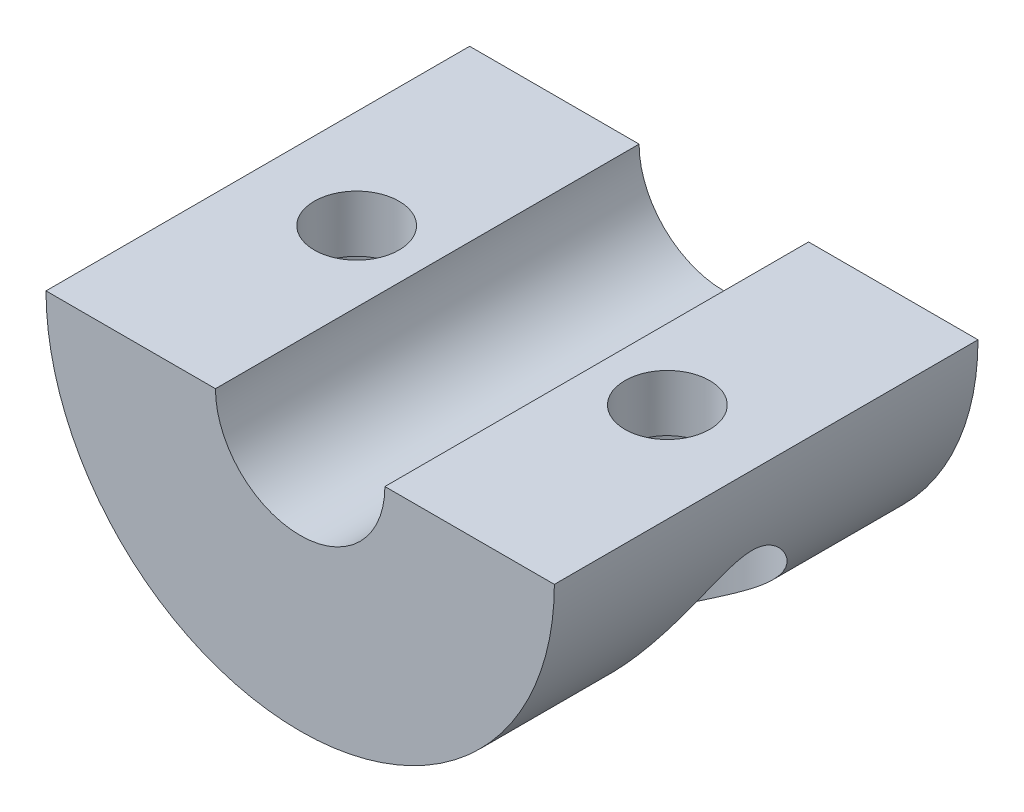
ISO-10303-21;
HEADER;
FILE_DESCRIPTION(('STEP AP214'),'2;1');
FILE_NAME('part.step','',(''),(''),'','','');
FILE_SCHEMA(('AUTOMOTIVE_DESIGN { 1 0 10303 214 1 1 1 1 }'));
ENDSEC;
DATA;
#1=APPLICATION_CONTEXT('core data for automotive mechanical design processes');
#2=APPLICATION_PROTOCOL_DEFINITION('international standard','automotive_design',2000,#1);
#3=PRODUCT_CONTEXT('',#1,'mechanical');
#4=PRODUCT('Part','Part','',(#3));
#5=PRODUCT_RELATED_PRODUCT_CATEGORY('part','',(#4));
#6=PRODUCT_DEFINITION_FORMATION('','',#4);
#7=PRODUCT_DEFINITION_CONTEXT('part definition',#1,'design');
#8=PRODUCT_DEFINITION('design','',#6,#7);
#9=PRODUCT_DEFINITION_SHAPE('','',#8);
#10=(LENGTH_UNIT() NAMED_UNIT(*) SI_UNIT(.MILLI.,.METRE.));
#11=(NAMED_UNIT(*) PLANE_ANGLE_UNIT() SI_UNIT($,.RADIAN.));
#12=(NAMED_UNIT(*) SI_UNIT($,.STERADIAN.) SOLID_ANGLE_UNIT());
#13=UNCERTAINTY_MEASURE_WITH_UNIT(LENGTH_MEASURE(1.E-05),#10,'distance_accuracy_value','');
#14=(GEOMETRIC_REPRESENTATION_CONTEXT(3) GLOBAL_UNCERTAINTY_ASSIGNED_CONTEXT((#13)) GLOBAL_UNIT_ASSIGNED_CONTEXT((#10,
#11,#12)) REPRESENTATION_CONTEXT('',''));
#15=CARTESIAN_POINT('',(0.,0.,0.));
#16=DIRECTION('',(0.,0.,1.));
#17=DIRECTION('',(1.,0.,0.));
#18=AXIS2_PLACEMENT_3D('',#15,#16,#17);
#19=CARTESIAN_POINT('',(0.,0.,15.));
#20=DIRECTION('',(0.,0.,-1.));
#21=DIRECTION('',(-1.,0.,0.));
#22=AXIS2_PLACEMENT_3D('',#19,#20,#21);
#23=CYLINDRICAL_SURFACE('',#22,9.);
#24=CARTESIAN_POINT('',(5.5,-7.1239034243875,10.5));
#25=CARTESIAN_POINT('',(5.60043019334585,-7.04636290751093,10.4999986467329));
#26=CARTESIAN_POINT('',(5.69925774388211,-6.9666650467977,10.4949544002959));
#27=CARTESIAN_POINT('',(5.89295478669658,-6.80361486085154,10.4757477643885));
#28=CARTESIAN_POINT('',(5.98782124651145,-6.72025983243076,10.4615785206694));
#29=CARTESIAN_POINT('',(6.26637499477537,-6.46497698418274,10.4066433790906));
#30=CARTESIAN_POINT('',(6.44342056919998,-6.28829329603147,10.3534607922039));
#31=CARTESIAN_POINT('',(6.72669497110865,-5.98173078980887,10.2406038234333));
#32=CARTESIAN_POINT('',(6.8381108383174,-5.85391775878404,10.1877961165076));
#33=CARTESIAN_POINT('',(7.05124941686432,-5.59534735528108,10.0706824952772));
#34=CARTESIAN_POINT('',(7.15296710511801,-5.46458849991925,10.0063706715827));
#35=CARTESIAN_POINT('',(7.34658575479974,-5.20138388262752,9.86734759907076));
#36=CARTESIAN_POINT('',(7.43848615674092,-5.06893802503633,9.79263575811495));
#37=CARTESIAN_POINT('',(7.61250723220998,-4.8036299305669,9.63336159329271));
#38=CARTESIAN_POINT('',(7.69463234955453,-4.6707679112846,9.5488037802291));
#39=CARTESIAN_POINT('',(7.81765615984879,-4.46010168389394,9.40614099716847));
#40=CARTESIAN_POINT('',(7.86172089471834,-4.38191640123308,9.35129179519915));
#41=CARTESIAN_POINT('',(7.94640337586003,-4.22640556362927,9.23785030300556));
#42=CARTESIAN_POINT('',(7.98702164504367,-4.14907987981719,9.17925858298405));
#43=CARTESIAN_POINT('',(8.06467882562589,-3.99603595922548,9.05807401696405));
#44=CARTESIAN_POINT('',(8.10172421151354,-3.92031501651726,8.99548876336166));
#45=CARTESIAN_POINT('',(8.17217152543776,-3.77125943543762,8.86563405018168));
#46=CARTESIAN_POINT('',(8.2055749731205,-3.69792381079343,8.79836656367216));
#47=CARTESIAN_POINT('',(8.2694908076608,-3.5527460407403,8.6559482853786));
#48=CARTESIAN_POINT('',(8.29987701564049,-3.48102611812021,8.58061449515018));
#49=CARTESIAN_POINT('',(8.35593750619934,-3.34420960098481,8.42232386942591));
#50=CARTESIAN_POINT('',(8.38161226945432,-3.27911233110877,8.33936781287408));
#51=CARTESIAN_POINT('',(8.42079893640972,-3.17683580623818,8.18793329146569));
#52=CARTESIAN_POINT('',(8.43571567996303,-3.13689517287922,8.12171962866343));
#53=CARTESIAN_POINT('',(8.46157495554027,-3.06645627486888,7.98370485799562));
#54=CARTESIAN_POINT('',(8.47252760762405,-3.03593399561619,7.91191855458994));
#55=CARTESIAN_POINT('',(8.48720168162957,-2.99462297630504,7.78234102144865));
#56=CARTESIAN_POINT('',(8.49205656710563,-2.98078260240889,7.72567250448905));
#57=CARTESIAN_POINT('',(8.49850807585127,-2.96234057463549,7.61068339657109));
#58=CARTESIAN_POINT('',(8.50010915093059,-2.95772629790397,7.55236517370155));
#59=CARTESIAN_POINT('',(8.49987896510568,-2.95838763385528,7.43569253207026));
#60=CARTESIAN_POINT('',(8.49804175039547,-2.96368040176206,7.37733822576415));
#61=CARTESIAN_POINT('',(8.49113203826252,-2.98341754285782,7.26238776180772));
#62=CARTESIAN_POINT('',(8.4860551654364,-2.9978742925221,7.20579409060414));
#63=CARTESIAN_POINT('',(8.47034221935345,-3.04204687664961,7.07177875243727));
#64=CARTESIAN_POINT('',(8.45825573104125,-3.0756479172715,6.99583445616859));
#65=CARTESIAN_POINT('',(8.42972690750022,-3.15299899707453,6.85018950683518));
#66=CARTESIAN_POINT('',(8.41327067954728,-3.19678134956594,6.78050973347005));
#67=CARTESIAN_POINT('',(8.37687697666611,-3.29097186314484,6.64653441513459));
#68=CARTESIAN_POINT('',(8.35692870286264,-3.34140045401913,6.58225651538883));
#69=CARTESIAN_POINT('',(8.31410896358434,-3.44656707237235,6.45832219541537));
#70=CARTESIAN_POINT('',(8.29123445334299,-3.50130956538103,6.39867069432915));
#71=CARTESIAN_POINT('',(8.24283434879403,-3.6137848737002,6.28312256201752));
#72=CARTESIAN_POINT('',(8.21730240511155,-3.67152467762006,6.22723547477037));
#73=CARTESIAN_POINT('',(8.16381033052517,-3.78898103961282,6.11878153210275));
#74=CARTESIAN_POINT('',(8.13584932339549,-3.84869830616021,6.06621588672175));
#75=CARTESIAN_POINT('',(8.04530384584113,-4.03646184175983,5.90724075451792));
#76=CARTESIAN_POINT('',(7.97872335207041,-4.16681014888681,5.8057969912726));
#77=CARTESIAN_POINT('',(7.83568236138279,-4.42996669387672,5.61349113049572));
#78=CARTESIAN_POINT('',(7.75921293771835,-4.56277706030345,5.5226387364448));
#79=CARTESIAN_POINT('',(7.59649726014491,-4.82882367227846,5.35088714226454));
#80=CARTESIAN_POINT('',(7.5102521745918,-4.96205986508748,5.26998675510812));
#81=CARTESIAN_POINT('',(7.32794574765696,-5.22753690947968,5.11826338926049));
#82=CARTESIAN_POINT('',(7.23188589004114,-5.35977790827728,5.04743889119017));
#83=CARTESIAN_POINT('',(7.04551425498024,-5.60181400722508,4.926728206905));
#84=CARTESIAN_POINT('',(6.95660671900843,-5.71192087539517,4.87529762421303));
#85=CARTESIAN_POINT('',(6.77176317299134,-5.92989427986169,4.78092115522304));
#86=CARTESIAN_POINT('',(6.67582652501382,-6.03776061167353,4.73797604034065));
#87=CARTESIAN_POINT('',(6.47724316229137,-6.25031319787287,4.66164084855753));
#88=CARTESIAN_POINT('',(6.37460922339551,-6.35500497956469,4.62823319675822));
#89=CARTESIAN_POINT('',(6.16287764183733,-6.56054468257396,4.5721000772303));
#90=CARTESIAN_POINT('',(6.05378224472745,-6.66139391950082,4.54937092264594));
#91=CARTESIAN_POINT('',(5.77584169683271,-6.90565983475348,4.50801721134293));
#92=CARTESIAN_POINT('',(5.60336985155964,-7.04637268929583,4.49655203742218));
#93=CARTESIAN_POINT('',(5.33772983337906,-7.24713989742888,4.50308297485385));
#94=CARTESIAN_POINT('',(5.24803474925059,-7.31234079906852,4.50921339222149));
#95=CARTESIAN_POINT('',(5.06698862526219,-7.43894025653827,4.53001425687325));
#96=CARTESIAN_POINT('',(4.97563784928503,-7.50033941151723,4.54468335466634));
#97=CARTESIAN_POINT('',(4.73063356608244,-7.65860115201115,4.59612457577166));
#98=CARTESIAN_POINT('',(4.57612376275255,-7.75175629668295,4.6411157755263));
#99=CARTESIAN_POINT('',(4.34674587907463,-7.88121869107903,4.72930472542871));
#100=CARTESIAN_POINT('',(4.27065575214319,-7.92267498642051,4.76216792940731));
#101=CARTESIAN_POINT('',(4.1200173971631,-8.00204178125944,4.83492420540464));
#102=CARTESIAN_POINT('',(4.04546844345582,-8.03995398053567,4.87481388071434));
#103=CARTESIAN_POINT('',(3.89830053253784,-8.11233795619825,4.96190690681698));
#104=CARTESIAN_POINT('',(3.82569591949428,-8.14678761434575,5.00915289807265));
#105=CARTESIAN_POINT('',(3.68380533022886,-8.21192232818842,5.11064029507273));
#106=CARTESIAN_POINT('',(3.61451791728334,-8.24260902283137,5.16487863405359));
#107=CARTESIAN_POINT('',(3.48011868426986,-8.30024839335575,5.28010910184128));
#108=CARTESIAN_POINT('',(3.41500714867262,-8.3272008149944,5.3411016899936));
#109=CARTESIAN_POINT('',(3.28982965206059,-8.37744415209126,5.46943854864975));
#110=CARTESIAN_POINT('',(3.2297632242726,-8.40073540645469,5.53678223032407));
#111=CARTESIAN_POINT('',(3.12109020521157,-8.44167226404446,5.67039364278036));
#112=CARTESIAN_POINT('',(3.07193749985787,-8.45964768884358,5.73611737340666));
#113=CARTESIAN_POINT('',(2.97889077848157,-8.49285882635141,5.87187742751455));
#114=CARTESIAN_POINT('',(2.93499858733262,-8.50809358923675,5.94191523486808));
#115=CARTESIAN_POINT('',(2.85298141367857,-8.53594605946476,6.08573762245318));
#116=CARTESIAN_POINT('',(2.81485319228271,-8.54856523804749,6.15952006712771));
#117=CARTESIAN_POINT('',(2.74471863566083,-8.57134016724721,6.31031367065734));
#118=CARTESIAN_POINT('',(2.71271455188422,-8.58149501225463,6.38732600429695));
#119=CARTESIAN_POINT('',(2.62840481693083,-8.60784148837358,6.6169207069472));
#120=CARTESIAN_POINT('',(2.58487625815975,-8.62087186905231,6.77321453767704));
#121=CARTESIAN_POINT('',(2.52358063814606,-8.63901423057393,7.09112712714489));
#122=CARTESIAN_POINT('',(2.50581265523487,-8.64412649471369,7.25274569516147));
#123=CARTESIAN_POINT('',(2.49661430318035,-8.64678801315301,7.57661524078175));
#124=CARTESIAN_POINT('',(2.50515181729307,-8.64434648996062,7.73886520585135));
#125=CARTESIAN_POINT('',(2.54821028115071,-8.63175062515168,8.05956930477715));
#126=CARTESIAN_POINT('',(2.58273108401086,-8.62159632713582,8.218023460086));
#127=CARTESIAN_POINT('',(2.676542242543,-8.59293370020968,8.52669922860852));
#128=CARTESIAN_POINT('',(2.73584235769209,-8.57442207948772,8.67691757170039));
#129=CARTESIAN_POINT('',(2.87700189655624,-8.52809175434534,8.96477752268824));
#130=CARTESIAN_POINT('',(2.95885948029607,-8.50027380898677,9.10242015514523));
#131=CARTESIAN_POINT('',(3.14186159051849,-8.43434170146736,9.36125794716261));
#132=CARTESIAN_POINT('',(3.24298938794786,-8.39623645814861,9.48246721795082));
#133=CARTESIAN_POINT('',(3.46049990367638,-8.30894930330458,9.70561059076733));
#134=CARTESIAN_POINT('',(3.57688089951245,-8.25976864201799,9.80754686602316));
#135=CARTESIAN_POINT('',(3.8223857497299,-8.14909655962454,9.99190376613806));
#136=CARTESIAN_POINT('',(3.95169412100917,-8.08740822259844,10.0739591708971));
#137=CARTESIAN_POINT('',(4.21646733608392,-7.95257738930879,10.2157185611764));
#138=CARTESIAN_POINT('',(4.3519359665733,-7.87942777839061,10.2754085846717));
#139=CARTESIAN_POINT('',(4.63488442071023,-7.71663587980039,10.3767796183798));
#140=CARTESIAN_POINT('',(4.78249357473883,-7.62616200338851,10.4167438543157));
#141=CARTESIAN_POINT('',(5.07502471514588,-7.43469232828908,10.4734798716841));
#142=CARTESIAN_POINT('',(5.21994936629465,-7.33370770433404,10.4902760193062));
#143=CARTESIAN_POINT('',(5.40826060017704,-7.19403088314724,10.4989568606818));
#144=CARTESIAN_POINT('',(5.45429625181789,-7.15919054411886,10.5000006158445));
#145=CARTESIAN_POINT('',(5.5,-7.1239034243875,10.5));
#146=B_SPLINE_CURVE_WITH_KNOTS('',3,(#24,#25,#26,#27,#28,#29,#30,#31,#32,#33,#34,#35,#36,#37,
#38,#39,#40,#41,#42,#43,#44,#45,#46,#47,#48,#49,#50,#51,#52,#53,#54,#55,#56,#57,#58,#59,#60,#61,
#62,#63,#64,#65,#66,#67,#68,#69,#70,#71,#72,#73,#74,#75,#76,#77,#78,#79,#80,#81,#82,#83,#84,#85,
#86,#87,#88,#89,#90,#91,#92,#93,#94,#95,#96,#97,#98,#99,#100,#101,#102,#103,#104,#105,#106,#107,
#108,#109,#110,#111,#112,#113,#114,#115,#116,#117,#118,#119,#120,#121,#122,#123,#124,#125,#126,
#127,#128,#129,#130,#131,#132,#133,#134,#135,#136,#137,#138,#139,#140,#141,#142,#143,#144,#145),
.UNSPECIFIED.,.T.,.F.,(4,2,2,2,2,2,2,2,2,2,2,2,2,2,2,2,2,2,2,2,2,2,2,2,2,2,2,2,2,2,2,2,2,2,2,2,
2,2,2,2,2,2,2,2,2,2,2,2,2,2,2,2,2,2,2,2,2,2,2,2,4),(0.,0.380611628159881,0.761509487029967,
1.5255427927789,2.0577383512727,2.59020807506974,3.12270812813085,3.65496517609149,
3.97040335728025,4.28579359303138,4.60060112084676,4.91527678430269,5.23998824259449,
5.56466655440207,5.80034473645272,6.03541693170867,6.21030171749814,6.3849470672812,
6.55989511602384,6.73507994687368,6.98540027120651,7.23652617143592,7.48844283826166,
7.74062379098699,7.99342174512516,8.24631127169111,8.77977233970314,9.31371836968195,
9.8476006512921,10.3814023413697,10.8327462346096,11.2841311407569,11.7346788202228,
12.1850708291661,12.8508223315292,13.1836483295093,13.5164217404645,14.0714823294034,
14.3492250941236,14.6268339601755,14.9061163779935,15.1852767198309,15.4644560585819,
15.7436095391517,15.995344468053,16.247166472639,16.498846443139,16.7506187630708,
17.2363930450724,17.7221499464865,18.2073140157073,18.6924753422932,19.1778279328803,
19.6631409457755,20.1480345476021,20.6328734400599,21.1260387996812,21.6195115164703,
22.1505486331549,22.6810268240383,22.8542354720462),.UNSPECIFIED.);
#147=CARTESIAN_POINT('',(5.5,-7.1239034243875,10.5));
#148=VERTEX_POINT('',#147);
#149=EDGE_CURVE('E111',#148,#148,#146,.T.);
#150=ORIENTED_EDGE('',*,*,#149,.T.);
#151=EDGE_LOOP('',(#150));
#152=FACE_BOUND('',#151,.T.);
#153=CARTESIAN_POINT('',(0.,0.,0.));
#154=DIRECTION('',(0.,0.,1.));
#155=DIRECTION('',(1.,0.,0.));
#156=AXIS2_PLACEMENT_3D('',#153,#154,#155);
#157=CIRCLE('',#156,9.);
#158=CARTESIAN_POINT('',(-9.,0.,0.));
#159=VERTEX_POINT('',#158);
#160=CARTESIAN_POINT('',(9.,0.,0.));
#161=VERTEX_POINT('',#160);
#162=EDGE_CURVE('E108',#159,#161,#157,.T.);
#163=ORIENTED_EDGE('',*,*,#162,.T.);
#164=DIRECTION('',(0.,0.,-1.));
#165=VECTOR('',#164,1.);
#166=CARTESIAN_POINT('',(9.,0.,15.));
#167=LINE('',#166,#165);
#168=CARTESIAN_POINT('',(9.,0.,15.));
#169=VERTEX_POINT('',#168);
#170=EDGE_CURVE('E72',#169,#161,#167,.T.);
#171=ORIENTED_EDGE('',*,*,#170,.F.);
#172=CARTESIAN_POINT('',(0.,0.,15.));
#173=DIRECTION('',(0.,0.,1.));
#174=DIRECTION('',(1.,0.,0.));
#175=AXIS2_PLACEMENT_3D('',#172,#173,#174);
#176=CIRCLE('',#175,9.);
#177=CARTESIAN_POINT('',(-9.,0.,15.));
#178=VERTEX_POINT('',#177);
#179=EDGE_CURVE('E94',#178,#169,#176,.T.);
#180=ORIENTED_EDGE('',*,*,#179,.F.);
#181=DIRECTION('',(0.,0.,-1.));
#182=VECTOR('',#181,1.);
#183=CARTESIAN_POINT('',(-9.,0.,15.));
#184=LINE('',#183,#182);
#185=EDGE_CURVE('E49',#178,#159,#184,.T.);
#186=ORIENTED_EDGE('',*,*,#185,.T.);
#187=EDGE_LOOP('',(#163,#171,#180,#186));
#188=FACE_BOUND('',#187,.T.);
#189=CARTESIAN_POINT('',(-5.5,-7.1239034243875,10.5));
#190=CARTESIAN_POINT('',(-5.60043019334585,-7.04636290751093,10.4999986467329));
#191=CARTESIAN_POINT('',(-5.69925774388211,-6.9666650467977,10.4949544002959));
#192=CARTESIAN_POINT('',(-5.89295478669658,-6.80361486085154,10.4757477643885));
#193=CARTESIAN_POINT('',(-5.98782124651145,-6.72025983243076,10.4615785206694));
#194=CARTESIAN_POINT('',(-6.26637499477537,-6.46497698418274,10.4066433790906));
#195=CARTESIAN_POINT('',(-6.44342056919998,-6.28829329603147,10.3534607922039));
#196=CARTESIAN_POINT('',(-6.72669497110865,-5.98173078980887,10.2406038234333));
#197=CARTESIAN_POINT('',(-6.8381108383174,-5.85391775878404,10.1877961165076));
#198=CARTESIAN_POINT('',(-7.05124941686432,-5.59534735528108,10.0706824952772));
#199=CARTESIAN_POINT('',(-7.15296710511801,-5.46458849991925,10.0063706715827));
#200=CARTESIAN_POINT('',(-7.34658575479974,-5.20138388262752,9.86734759907076));
#201=CARTESIAN_POINT('',(-7.43848615674092,-5.06893802503633,9.79263575811495));
#202=CARTESIAN_POINT('',(-7.61250723220998,-4.8036299305669,9.63336159329271));
#203=CARTESIAN_POINT('',(-7.69463234955453,-4.6707679112846,9.5488037802291));
#204=CARTESIAN_POINT('',(-7.81765615984879,-4.46010168389394,9.40614099716847));
#205=CARTESIAN_POINT('',(-7.86172089471834,-4.38191640123308,9.35129179519915));
#206=CARTESIAN_POINT('',(-7.94640337586003,-4.22640556362927,9.23785030300556));
#207=CARTESIAN_POINT('',(-7.98702164504367,-4.14907987981719,9.17925858298405));
#208=CARTESIAN_POINT('',(-8.06467882562589,-3.99603595922548,9.05807401696405));
#209=CARTESIAN_POINT('',(-8.10172421151354,-3.92031501651726,8.99548876336166));
#210=CARTESIAN_POINT('',(-8.17217152543776,-3.77125943543762,8.86563405018168));
#211=CARTESIAN_POINT('',(-8.2055749731205,-3.69792381079343,8.79836656367216));
#212=CARTESIAN_POINT('',(-8.2694908076608,-3.5527460407403,8.6559482853786));
#213=CARTESIAN_POINT('',(-8.29987701564049,-3.48102611812021,8.58061449515018));
#214=CARTESIAN_POINT('',(-8.35593750619934,-3.34420960098481,8.42232386942591));
#215=CARTESIAN_POINT('',(-8.38161226945432,-3.27911233110877,8.33936781287408));
#216=CARTESIAN_POINT('',(-8.42079893640972,-3.17683580623818,8.18793329146569));
#217=CARTESIAN_POINT('',(-8.43571567996303,-3.13689517287922,8.12171962866343));
#218=CARTESIAN_POINT('',(-8.46157495554027,-3.06645627486888,7.98370485799562));
#219=CARTESIAN_POINT('',(-8.47252760762405,-3.03593399561619,7.91191855458994));
#220=CARTESIAN_POINT('',(-8.48720168162957,-2.99462297630504,7.78234102144865));
#221=CARTESIAN_POINT('',(-8.49205656710563,-2.98078260240889,7.72567250448905));
#222=CARTESIAN_POINT('',(-8.49850807585127,-2.96234057463549,7.61068339657109));
#223=CARTESIAN_POINT('',(-8.50010915093059,-2.95772629790397,7.55236517370155));
#224=CARTESIAN_POINT('',(-8.49987896510568,-2.95838763385528,7.43569253207026));
#225=CARTESIAN_POINT('',(-8.49804175039547,-2.96368040176206,7.37733822576415));
#226=CARTESIAN_POINT('',(-8.49113203826252,-2.98341754285782,7.26238776180772));
#227=CARTESIAN_POINT('',(-8.4860551654364,-2.9978742925221,7.20579409060414));
#228=CARTESIAN_POINT('',(-8.47034221935345,-3.04204687664961,7.07177875243727));
#229=CARTESIAN_POINT('',(-8.45825573104125,-3.0756479172715,6.99583445616859));
#230=CARTESIAN_POINT('',(-8.42972690750022,-3.15299899707453,6.85018950683518));
#231=CARTESIAN_POINT('',(-8.41327067954728,-3.19678134956594,6.78050973347005));
#232=CARTESIAN_POINT('',(-8.37687697666611,-3.29097186314484,6.64653441513459));
#233=CARTESIAN_POINT('',(-8.35692870286264,-3.34140045401913,6.58225651538883));
#234=CARTESIAN_POINT('',(-8.31410896358434,-3.44656707237235,6.45832219541537));
#235=CARTESIAN_POINT('',(-8.29123445334299,-3.50130956538103,6.39867069432915));
#236=CARTESIAN_POINT('',(-8.24283434879403,-3.6137848737002,6.28312256201752));
#237=CARTESIAN_POINT('',(-8.21730240511155,-3.67152467762006,6.22723547477037));
#238=CARTESIAN_POINT('',(-8.16381033052517,-3.78898103961282,6.11878153210275));
#239=CARTESIAN_POINT('',(-8.13584932339549,-3.84869830616021,6.06621588672175));
#240=CARTESIAN_POINT('',(-8.04530384584113,-4.03646184175983,5.90724075451792));
#241=CARTESIAN_POINT('',(-7.97872335207041,-4.16681014888681,5.8057969912726));
#242=CARTESIAN_POINT('',(-7.83568236138279,-4.42996669387672,5.61349113049572));
#243=CARTESIAN_POINT('',(-7.75921293771835,-4.56277706030345,5.5226387364448));
#244=CARTESIAN_POINT('',(-7.59649726014491,-4.82882367227846,5.35088714226454));
#245=CARTESIAN_POINT('',(-7.5102521745918,-4.96205986508748,5.26998675510812));
#246=CARTESIAN_POINT('',(-7.32794574765696,-5.22753690947968,5.11826338926049));
#247=CARTESIAN_POINT('',(-7.23188589004114,-5.35977790827728,5.04743889119017));
#248=CARTESIAN_POINT('',(-7.04551425498024,-5.60181400722508,4.926728206905));
#249=CARTESIAN_POINT('',(-6.95660671900843,-5.71192087539517,4.87529762421303));
#250=CARTESIAN_POINT('',(-6.77176317299134,-5.92989427986169,4.78092115522304));
#251=CARTESIAN_POINT('',(-6.67582652501382,-6.03776061167353,4.73797604034065));
#252=CARTESIAN_POINT('',(-6.47724316229137,-6.25031319787287,4.66164084855753));
#253=CARTESIAN_POINT('',(-6.37460922339551,-6.35500497956469,4.62823319675822));
#254=CARTESIAN_POINT('',(-6.16287764183733,-6.56054468257396,4.5721000772303));
#255=CARTESIAN_POINT('',(-6.05378224472745,-6.66139391950082,4.54937092264594));
#256=CARTESIAN_POINT('',(-5.77584169683271,-6.90565983475348,4.50801721134293));
#257=CARTESIAN_POINT('',(-5.60336985155964,-7.04637268929583,4.49655203742218));
#258=CARTESIAN_POINT('',(-5.33772983337906,-7.24713989742888,4.50308297485385));
#259=CARTESIAN_POINT('',(-5.24803474925059,-7.31234079906852,4.50921339222149));
#260=CARTESIAN_POINT('',(-5.06698862526219,-7.43894025653827,4.53001425687325));
#261=CARTESIAN_POINT('',(-4.97563784928503,-7.50033941151723,4.54468335466634));
#262=CARTESIAN_POINT('',(-4.73063356608244,-7.65860115201115,4.59612457577166));
#263=CARTESIAN_POINT('',(-4.57612376275255,-7.75175629668295,4.6411157755263));
#264=CARTESIAN_POINT('',(-4.34674587907463,-7.88121869107903,4.72930472542871));
#265=CARTESIAN_POINT('',(-4.27065575214319,-7.92267498642051,4.76216792940731));
#266=CARTESIAN_POINT('',(-4.1200173971631,-8.00204178125944,4.83492420540464));
#267=CARTESIAN_POINT('',(-4.04546844345582,-8.03995398053567,4.87481388071434));
#268=CARTESIAN_POINT('',(-3.89830053253784,-8.11233795619825,4.96190690681698));
#269=CARTESIAN_POINT('',(-3.82569591949428,-8.14678761434575,5.00915289807265));
#270=CARTESIAN_POINT('',(-3.68380533022886,-8.21192232818842,5.11064029507273));
#271=CARTESIAN_POINT('',(-3.61451791728334,-8.24260902283137,5.16487863405359));
#272=CARTESIAN_POINT('',(-3.48011868426986,-8.30024839335575,5.28010910184128));
#273=CARTESIAN_POINT('',(-3.41500714867262,-8.3272008149944,5.3411016899936));
#274=CARTESIAN_POINT('',(-3.28982965206059,-8.37744415209126,5.46943854864975));
#275=CARTESIAN_POINT('',(-3.2297632242726,-8.40073540645469,5.53678223032407));
#276=CARTESIAN_POINT('',(-3.12109020521157,-8.44167226404446,5.67039364278036));
#277=CARTESIAN_POINT('',(-3.07193749985787,-8.45964768884358,5.73611737340666));
#278=CARTESIAN_POINT('',(-2.97889077848157,-8.49285882635141,5.87187742751455));
#279=CARTESIAN_POINT('',(-2.93499858733262,-8.50809358923675,5.94191523486808));
#280=CARTESIAN_POINT('',(-2.85298141367857,-8.53594605946476,6.08573762245318));
#281=CARTESIAN_POINT('',(-2.81485319228271,-8.54856523804749,6.15952006712771));
#282=CARTESIAN_POINT('',(-2.74471863566083,-8.57134016724721,6.31031367065734));
#283=CARTESIAN_POINT('',(-2.71271455188422,-8.58149501225463,6.38732600429695));
#284=CARTESIAN_POINT('',(-2.62840481693083,-8.60784148837358,6.6169207069472));
#285=CARTESIAN_POINT('',(-2.58487625815975,-8.62087186905231,6.77321453767704));
#286=CARTESIAN_POINT('',(-2.52358063814606,-8.63901423057393,7.09112712714489));
#287=CARTESIAN_POINT('',(-2.50581265523487,-8.64412649471369,7.25274569516147));
#288=CARTESIAN_POINT('',(-2.49661430318035,-8.64678801315301,7.57661524078175));
#289=CARTESIAN_POINT('',(-2.50515181729307,-8.64434648996062,7.73886520585135));
#290=CARTESIAN_POINT('',(-2.54821028115071,-8.63175062515168,8.05956930477715));
#291=CARTESIAN_POINT('',(-2.58273108401086,-8.62159632713582,8.218023460086));
#292=CARTESIAN_POINT('',(-2.676542242543,-8.59293370020968,8.52669922860852));
#293=CARTESIAN_POINT('',(-2.73584235769209,-8.57442207948772,8.67691757170039));
#294=CARTESIAN_POINT('',(-2.87700189655624,-8.52809175434534,8.96477752268824));
#295=CARTESIAN_POINT('',(-2.95885948029607,-8.50027380898677,9.10242015514523));
#296=CARTESIAN_POINT('',(-3.14186159051849,-8.43434170146736,9.36125794716261));
#297=CARTESIAN_POINT('',(-3.24298938794786,-8.39623645814861,9.48246721795082));
#298=CARTESIAN_POINT('',(-3.46049990367638,-8.30894930330458,9.70561059076733));
#299=CARTESIAN_POINT('',(-3.57688089951245,-8.25976864201799,9.80754686602316));
#300=CARTESIAN_POINT('',(-3.8223857497299,-8.14909655962454,9.99190376613806));
#301=CARTESIAN_POINT('',(-3.95169412100917,-8.08740822259844,10.0739591708971));
#302=CARTESIAN_POINT('',(-4.21646733608392,-7.95257738930879,10.2157185611764));
#303=CARTESIAN_POINT('',(-4.3519359665733,-7.87942777839061,10.2754085846717));
#304=CARTESIAN_POINT('',(-4.63488442071023,-7.71663587980039,10.3767796183798));
#305=CARTESIAN_POINT('',(-4.78249357473883,-7.62616200338851,10.4167438543157));
#306=CARTESIAN_POINT('',(-5.07502471514588,-7.43469232828908,10.4734798716841));
#307=CARTESIAN_POINT('',(-5.21994936629465,-7.33370770433404,10.4902760193062));
#308=CARTESIAN_POINT('',(-5.40826060017704,-7.19403088314724,10.4989568606818));
#309=CARTESIAN_POINT('',(-5.45429625181789,-7.15919054411886,10.5000006158445));
#310=CARTESIAN_POINT('',(-5.5,-7.1239034243875,10.5));
#311=B_SPLINE_CURVE_WITH_KNOTS('',3,(#189,#190,#191,#192,#193,#194,#195,#196,#197,#198,#199,
#200,#201,#202,#203,#204,#205,#206,#207,#208,#209,#210,#211,#212,#213,#214,#215,#216,#217,#218,
#219,#220,#221,#222,#223,#224,#225,#226,#227,#228,#229,#230,#231,#232,#233,#234,#235,#236,#237,
#238,#239,#240,#241,#242,#243,#244,#245,#246,#247,#248,#249,#250,#251,#252,#253,#254,#255,#256,
#257,#258,#259,#260,#261,#262,#263,#264,#265,#266,#267,#268,#269,#270,#271,#272,#273,#274,#275,
#276,#277,#278,#279,#280,#281,#282,#283,#284,#285,#286,#287,#288,#289,#290,#291,#292,#293,#294,
#295,#296,#297,#298,#299,#300,#301,#302,#303,#304,#305,#306,#307,#308,#309,#310),.UNSPECIFIED.,
.T.,.F.,(4,2,2,2,2,2,2,2,2,2,2,2,2,2,2,2,2,2,2,2,2,2,2,2,2,2,2,2,2,2,2,2,2,2,2,2,2,2,2,2,2,2,2,
2,2,2,2,2,2,2,2,2,2,2,2,2,2,2,2,2,4),(0.,0.380611628159881,0.761509487029967,1.5255427927789,
2.0577383512727,2.59020807506974,3.12270812813085,3.65496517609149,3.97040335728025,
4.28579359303138,4.60060112084676,4.91527678430269,5.23998824259449,5.56466655440207,
5.80034473645272,6.03541693170867,6.21030171749814,6.3849470672812,6.55989511602384,
6.73507994687368,6.98540027120651,7.23652617143592,7.48844283826166,7.74062379098699,
7.99342174512516,8.24631127169111,8.77977233970314,9.31371836968195,9.8476006512921,
10.3814023413697,10.8327462346096,11.2841311407569,11.7346788202228,12.1850708291661,
12.8508223315292,13.1836483295093,13.5164217404645,14.0714823294034,14.3492250941236,
14.6268339601755,14.9061163779935,15.1852767198309,15.4644560585819,15.7436095391517,
15.995344468053,16.247166472639,16.498846443139,16.7506187630708,17.2363930450724,
17.7221499464865,18.2073140157073,18.6924753422932,19.1778279328803,19.6631409457755,
20.1480345476021,20.6328734400599,21.1260387996812,21.6195115164703,22.1505486331549,
22.6810268240383,22.8542354720462),.UNSPECIFIED.);
#312=CARTESIAN_POINT('',(-5.5,-7.1239034243875,10.5));
#313=VERTEX_POINT('',#312);
#314=EDGE_CURVE('E202',#313,#313,#311,.T.);
#315=ORIENTED_EDGE('',*,*,#314,.F.);
#316=EDGE_LOOP('',(#315));
#317=FACE_BOUND('',#316,.T.);
#318=ADVANCED_FACE('F39',(#152,#188,#317),#23,.T.);
#319=CARTESIAN_POINT('',(0.,0.,15.));
#320=DIRECTION('',(0.,0.,-1.));
#321=DIRECTION('',(-1.,0.,0.));
#322=AXIS2_PLACEMENT_3D('',#319,#320,#321);
#323=CYLINDRICAL_SURFACE('',#322,3.);
#324=CARTESIAN_POINT('',(0.,0.,0.));
#325=DIRECTION('',(0.,0.,1.));
#326=DIRECTION('',(1.,0.,0.));
#327=AXIS2_PLACEMENT_3D('',#324,#325,#326);
#328=CIRCLE('',#327,3.);
#329=CARTESIAN_POINT('',(-3.,0.,0.));
#330=VERTEX_POINT('',#329);
#331=CARTESIAN_POINT('',(3.,0.,0.));
#332=VERTEX_POINT('',#331);
#333=EDGE_CURVE('E117',#330,#332,#328,.T.);
#334=ORIENTED_EDGE('',*,*,#333,.F.);
#335=DIRECTION('',(0.,0.,-1.));
#336=VECTOR('',#335,1.);
#337=CARTESIAN_POINT('',(-3.,0.,15.));
#338=LINE('',#337,#336);
#339=CARTESIAN_POINT('',(-3.,0.,15.));
#340=VERTEX_POINT('',#339);
#341=EDGE_CURVE('E11',#340,#330,#338,.T.);
#342=ORIENTED_EDGE('',*,*,#341,.F.);
#343=CARTESIAN_POINT('',(0.,0.,15.));
#344=DIRECTION('',(0.,0.,1.));
#345=DIRECTION('',(1.,0.,0.));
#346=AXIS2_PLACEMENT_3D('',#343,#344,#345);
#347=CIRCLE('',#346,3.);
#348=CARTESIAN_POINT('',(3.,0.,15.));
#349=VERTEX_POINT('',#348);
#350=EDGE_CURVE('E101',#340,#349,#347,.T.);
#351=ORIENTED_EDGE('',*,*,#350,.T.);
#352=DIRECTION('',(0.,0.,-1.));
#353=VECTOR('',#352,1.);
#354=CARTESIAN_POINT('',(3.,0.,15.));
#355=LINE('',#354,#353);
#356=EDGE_CURVE('E58',#349,#332,#355,.T.);
#357=ORIENTED_EDGE('',*,*,#356,.T.);
#358=EDGE_LOOP('',(#334,#342,#351,#357));
#359=FACE_BOUND('',#358,.T.);
#360=ADVANCED_FACE('F41',(#359),#323,.F.);
#361=CARTESIAN_POINT('',(0.,0.,15.));
#362=DIRECTION('',(0.,1.,0.));
#363=DIRECTION('',(0.,0.,1.));
#364=AXIS2_PLACEMENT_3D('',#361,#362,#363);
#365=PLANE('',#364);
#366=CARTESIAN_POINT('',(-5.5,0.,7.5));
#367=DIRECTION('',(0.,1.,0.));
#368=DIRECTION('',(0.,0.,1.));
#369=AXIS2_PLACEMENT_3D('',#366,#367,#368);
#370=CIRCLE('',#369,1.5);
#371=CARTESIAN_POINT('',(-5.5,0.,9.));
#372=VERTEX_POINT('',#371);
#373=EDGE_CURVE('E43',#372,#372,#370,.F.);
#374=ORIENTED_EDGE('',*,*,#373,.T.);
#375=EDGE_LOOP('',(#374));
#376=FACE_BOUND('',#375,.T.);
#377=DIRECTION('',(1.,0.,0.));
#378=VECTOR('',#377,1.);
#379=CARTESIAN_POINT('',(0.,0.,0.));
#380=LINE('',#379,#378);
#381=EDGE_CURVE('E90',#159,#330,#380,.T.);
#382=ORIENTED_EDGE('',*,*,#381,.F.);
#383=ORIENTED_EDGE('',*,*,#185,.F.);
#384=DIRECTION('',(1.,0.,0.));
#385=VECTOR('',#384,1.);
#386=CARTESIAN_POINT('',(0.,0.,15.));
#387=LINE('',#386,#385);
#388=EDGE_CURVE('E88',#178,#340,#387,.T.);
#389=ORIENTED_EDGE('',*,*,#388,.T.);
#390=ORIENTED_EDGE('',*,*,#341,.T.);
#391=EDGE_LOOP('',(#382,#383,#389,#390));
#392=FACE_BOUND('',#391,.T.);
#393=ADVANCED_FACE('F86',(#376,#392),#365,.T.);
#394=CARTESIAN_POINT('',(5.5,0.,7.5));
#395=DIRECTION('',(0.,1.,0.));
#396=DIRECTION('',(0.,0.,1.));
#397=AXIS2_PLACEMENT_3D('',#394,#395,#396);
#398=CIRCLE('',#397,1.5);
#399=CARTESIAN_POINT('',(5.5,0.,9.));
#400=VERTEX_POINT('',#399);
#401=EDGE_CURVE('E119',#400,#400,#398,.T.);
#402=ORIENTED_EDGE('',*,*,#401,.F.);
#403=EDGE_LOOP('',(#402));
#404=FACE_BOUND('',#403,.T.);
#405=EDGE_CURVE('E103',#332,#161,#380,.T.);
#406=ORIENTED_EDGE('',*,*,#405,.F.);
#407=ORIENTED_EDGE('',*,*,#356,.F.);
#408=EDGE_CURVE('E98',#349,#169,#387,.T.);
#409=ORIENTED_EDGE('',*,*,#408,.T.);
#410=ORIENTED_EDGE('',*,*,#170,.T.);
#411=EDGE_LOOP('',(#406,#407,#409,#410));
#412=FACE_BOUND('',#411,.T.);
#413=ADVANCED_FACE('F133',(#404,#412),#365,.T.);
#414=CARTESIAN_POINT('',(0.,0.,15.));
#415=DIRECTION('',(0.,0.,1.));
#416=DIRECTION('',(1.,0.,0.));
#417=AXIS2_PLACEMENT_3D('',#414,#415,#416);
#418=PLANE('',#417);
#419=ORIENTED_EDGE('',*,*,#350,.F.);
#420=ORIENTED_EDGE('',*,*,#388,.F.);
#421=ORIENTED_EDGE('',*,*,#179,.T.);
#422=ORIENTED_EDGE('',*,*,#408,.F.);
#423=EDGE_LOOP('',(#419,#420,#421,#422));
#424=FACE_BOUND('',#423,.T.);
#425=ADVANCED_FACE('F100',(#424),#418,.T.);
#426=CARTESIAN_POINT('',(0.,0.,0.));
#427=DIRECTION('',(0.,0.,1.));
#428=DIRECTION('',(1.,0.,0.));
#429=AXIS2_PLACEMENT_3D('',#426,#427,#428);
#430=PLANE('',#429);
#431=ORIENTED_EDGE('',*,*,#333,.T.);
#432=ORIENTED_EDGE('',*,*,#405,.T.);
#433=ORIENTED_EDGE('',*,*,#162,.F.);
#434=ORIENTED_EDGE('',*,*,#381,.T.);
#435=EDGE_LOOP('',(#431,#432,#433,#434));
#436=FACE_BOUND('',#435,.T.);
#437=ADVANCED_FACE('F128',(#436),#430,.F.);
#438=CARTESIAN_POINT('',(5.5,-17.,7.5));
#439=DIRECTION('',(0.,1.,0.));
#440=DIRECTION('',(0.,0.,1.));
#441=AXIS2_PLACEMENT_3D('',#438,#439,#440);
#442=CYLINDRICAL_SURFACE('',#441,3.);
#443=CARTESIAN_POINT('',(5.5,-2.,7.5));
#444=DIRECTION('',(0.,1.,0.));
#445=DIRECTION('',(0.,0.,1.));
#446=AXIS2_PLACEMENT_3D('',#443,#444,#445);
#447=CIRCLE('',#446,3.);
#448=CARTESIAN_POINT('',(5.5,-2.,10.5));
#449=VERTEX_POINT('',#448);
#450=EDGE_CURVE('E118',#449,#449,#447,.T.);
#451=ORIENTED_EDGE('',*,*,#450,.T.);
#452=EDGE_LOOP('',(#451));
#453=FACE_BOUND('',#452,.T.);
#454=ORIENTED_EDGE('',*,*,#149,.F.);
#455=EDGE_LOOP('',(#454));
#456=FACE_BOUND('',#455,.T.);
#457=ADVANCED_FACE('F122',(#453,#456),#442,.F.);
#458=CARTESIAN_POINT('',(5.5,-2.,7.5));
#459=DIRECTION('',(0.,1.,0.));
#460=DIRECTION('',(0.,0.,1.));
#461=AXIS2_PLACEMENT_3D('',#458,#459,#460);
#462=PLANE('',#461);
#463=CARTESIAN_POINT('',(5.5,-2.,7.5));
#464=DIRECTION('',(0.,-1.,0.));
#465=DIRECTION('',(0.,0.,-1.));
#466=AXIS2_PLACEMENT_3D('',#463,#464,#465);
#467=CIRCLE('',#466,1.5);
#468=CARTESIAN_POINT('',(5.5,-2.,6.));
#469=VERTEX_POINT('',#468);
#470=EDGE_CURVE('E206',#469,#469,#467,.T.);
#471=ORIENTED_EDGE('',*,*,#470,.F.);
#472=EDGE_LOOP('',(#471));
#473=FACE_BOUND('',#472,.T.);
#474=ORIENTED_EDGE('',*,*,#450,.F.);
#475=EDGE_LOOP('',(#474));
#476=FACE_BOUND('',#475,.T.);
#477=ADVANCED_FACE('F127',(#473,#476),#462,.F.);
#478=CARTESIAN_POINT('',(5.5,13.,7.5));
#479=DIRECTION('',(0.,-1.,0.));
#480=DIRECTION('',(0.,0.,-1.));
#481=AXIS2_PLACEMENT_3D('',#478,#479,#480);
#482=CYLINDRICAL_SURFACE('',#481,1.5);
#483=ORIENTED_EDGE('',*,*,#401,.T.);
#484=EDGE_LOOP('',(#483));
#485=FACE_BOUND('',#484,.T.);
#486=ORIENTED_EDGE('',*,*,#470,.T.);
#487=EDGE_LOOP('',(#486));
#488=FACE_BOUND('',#487,.T.);
#489=ADVANCED_FACE('F174',(#485,#488),#482,.F.);
#490=CARTESIAN_POINT('',(-5.5,-17.,7.5));
#491=DIRECTION('',(0.,1.,0.));
#492=DIRECTION('',(0.,0.,1.));
#493=AXIS2_PLACEMENT_3D('',#490,#491,#492);
#494=CYLINDRICAL_SURFACE('',#493,3.);
#495=CARTESIAN_POINT('',(-5.5,-2.,7.5));
#496=DIRECTION('',(0.,-1.,0.));
#497=DIRECTION('',(0.,0.,1.));
#498=AXIS2_PLACEMENT_3D('',#495,#496,#497);
#499=CIRCLE('',#498,3.);
#500=CARTESIAN_POINT('',(-5.5,-2.,10.5));
#501=VERTEX_POINT('',#500);
#502=EDGE_CURVE('E207',#501,#501,#499,.T.);
#503=ORIENTED_EDGE('',*,*,#502,.F.);
#504=EDGE_LOOP('',(#503));
#505=FACE_BOUND('',#504,.T.);
#506=ORIENTED_EDGE('',*,*,#314,.T.);
#507=EDGE_LOOP('',(#506));
#508=FACE_BOUND('',#507,.T.);
#509=ADVANCED_FACE('F168',(#505,#508),#494,.F.);
#510=CARTESIAN_POINT('',(-5.5,-2.,7.5));
#511=DIRECTION('',(0.,1.,0.));
#512=DIRECTION('',(0.,0.,1.));
#513=AXIS2_PLACEMENT_3D('',#510,#511,#512);
#514=PLANE('',#513);
#515=CARTESIAN_POINT('',(-5.5,-2.,7.5));
#516=DIRECTION('',(0.,1.,0.));
#517=DIRECTION('',(0.,0.,-1.));
#518=AXIS2_PLACEMENT_3D('',#515,#516,#517);
#519=CIRCLE('',#518,1.5);
#520=CARTESIAN_POINT('',(-5.5,-2.,6.));
#521=VERTEX_POINT('',#520);
#522=EDGE_CURVE('E217',#521,#521,#519,.T.);
#523=ORIENTED_EDGE('',*,*,#522,.T.);
#524=EDGE_LOOP('',(#523));
#525=FACE_BOUND('',#524,.T.);
#526=ORIENTED_EDGE('',*,*,#502,.T.);
#527=EDGE_LOOP('',(#526));
#528=FACE_BOUND('',#527,.T.);
#529=ADVANCED_FACE('F173',(#525,#528),#514,.F.);
#530=CARTESIAN_POINT('',(-5.5,13.,7.5));
#531=DIRECTION('',(0.,-1.,0.));
#532=DIRECTION('',(0.,0.,-1.));
#533=AXIS2_PLACEMENT_3D('',#530,#531,#532);
#534=CYLINDRICAL_SURFACE('',#533,1.5);
#535=ORIENTED_EDGE('',*,*,#373,.F.);
#536=EDGE_LOOP('',(#535));
#537=FACE_BOUND('',#536,.T.);
#538=ORIENTED_EDGE('',*,*,#522,.F.);
#539=EDGE_LOOP('',(#538));
#540=FACE_BOUND('',#539,.T.);
#541=ADVANCED_FACE('F185',(#537,#540),#534,.F.);
#542=CLOSED_SHELL('',(#318,#360,#393,#413,#425,#437,#457,#477,#489,#509,#529,#541));
#543=MANIFOLD_SOLID_BREP('B2',#542);
#544=ADVANCED_BREP_SHAPE_REPRESENTATION('',(#18,#543),#14);
#545=SHAPE_DEFINITION_REPRESENTATION(#9,#544);
ENDSEC;
END-ISO-10303-21;
